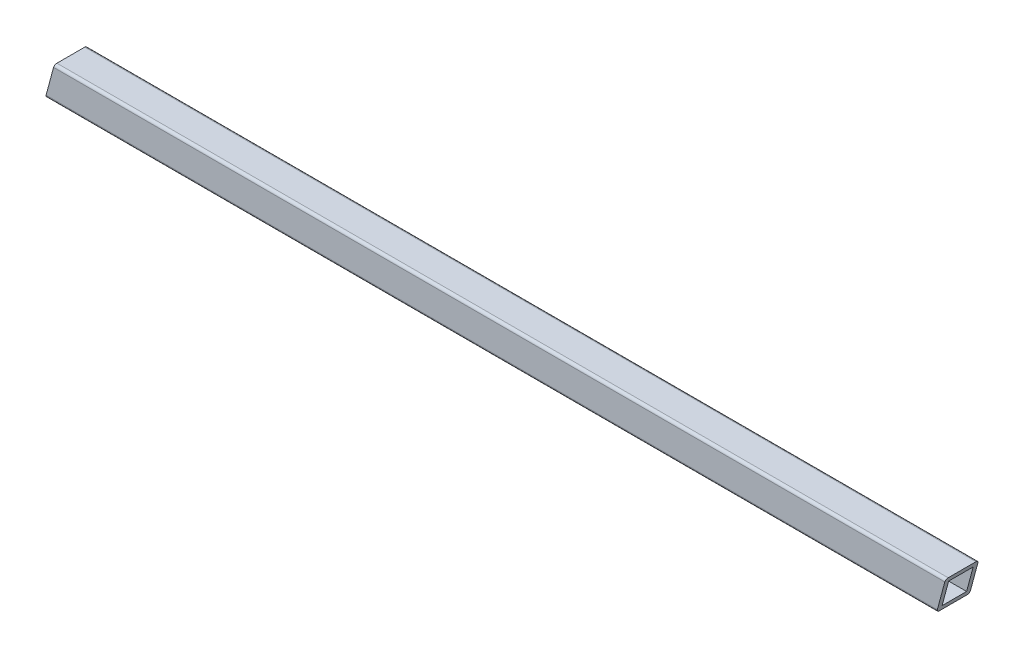
ISO-10303-21;
HEADER;
FILE_DESCRIPTION(('STEP AP214'),'2;1');
FILE_NAME('part.step','',(''),(''),'','','');
FILE_SCHEMA(('AUTOMOTIVE_DESIGN { 1 0 10303 214 1 1 1 1 }'));
ENDSEC;
DATA;
#1=APPLICATION_CONTEXT('core data for automotive mechanical design processes');
#2=APPLICATION_PROTOCOL_DEFINITION('international standard','automotive_design',2000,#1);
#3=PRODUCT_CONTEXT('',#1,'mechanical');
#4=PRODUCT('Part','Part','',(#3));
#5=PRODUCT_RELATED_PRODUCT_CATEGORY('part','',(#4));
#6=PRODUCT_DEFINITION_FORMATION('','',#4);
#7=PRODUCT_DEFINITION_CONTEXT('part definition',#1,'design');
#8=PRODUCT_DEFINITION('design','',#6,#7);
#9=PRODUCT_DEFINITION_SHAPE('','',#8);
#10=(LENGTH_UNIT() NAMED_UNIT(*) SI_UNIT(.MILLI.,.METRE.));
#11=(NAMED_UNIT(*) PLANE_ANGLE_UNIT() SI_UNIT($,.RADIAN.));
#12=(NAMED_UNIT(*) SI_UNIT($,.STERADIAN.) SOLID_ANGLE_UNIT());
#13=UNCERTAINTY_MEASURE_WITH_UNIT(LENGTH_MEASURE(1.E-05),#10,'distance_accuracy_value','');
#14=(GEOMETRIC_REPRESENTATION_CONTEXT(3) GLOBAL_UNCERTAINTY_ASSIGNED_CONTEXT((#13)) GLOBAL_UNIT_ASSIGNED_CONTEXT((#10,
#11,#12)) REPRESENTATION_CONTEXT('',''));
#15=CARTESIAN_POINT('',(0.,0.,0.));
#16=DIRECTION('',(0.,0.,1.));
#17=DIRECTION('',(1.,0.,0.));
#18=AXIS2_PLACEMENT_3D('',#15,#16,#17);
#19=CARTESIAN_POINT('',(1320.8,10.541,21.209));
#20=DIRECTION('',(-1.,0.,0.));
#21=DIRECTION('',(0.,0.,1.));
#22=AXIS2_PLACEMENT_3D('',#19,#20,#21);
#23=CYLINDRICAL_SURFACE('',#22,1.016);
#24=DIRECTION('',(-1.,0.,0.));
#25=VECTOR('',#24,1.);
#26=CARTESIAN_POINT('',(1320.8,9.525,21.209));
#27=LINE('',#26,#25);
#28=CARTESIAN_POINT('',(1215.79704525612,9.525,21.209));
#29=VERTEX_POINT('',#28);
#30=CARTESIAN_POINT('',(873.997711436341,9.525,21.209));
#31=VERTEX_POINT('',#30);
#32=EDGE_CURVE('E145',#29,#31,#27,.T.);
#33=ORIENTED_EDGE('',*,*,#32,.F.);
#34=CARTESIAN_POINT('',(1216.06928163563,10.541,21.209));
#35=DIRECTION('',(-0.965925826289069,0.258819045102517,0.));
#36=DIRECTION('',(-0.258819045102517,-0.965925826289069,0.));
#37=AXIS2_PLACEMENT_3D('',#34,#35,#36);
#38=ELLIPSE('',#37,1.05184059929664,1.016);
#39=CARTESIAN_POINT('',(1216.06928163563,10.541,22.225));
#40=VERTEX_POINT('',#39);
#41=EDGE_CURVE('E133',#29,#40,#38,.T.);
#42=ORIENTED_EDGE('',*,*,#41,.T.);
#43=DIRECTION('',(-1.,0.,0.));
#44=VECTOR('',#43,1.);
#45=CARTESIAN_POINT('',(1320.8,10.541,22.225));
#46=LINE('',#45,#44);
#47=CARTESIAN_POINT('',(874.269947815851,10.541,22.225));
#48=VERTEX_POINT('',#47);
#49=EDGE_CURVE('E143',#40,#48,#46,.T.);
#50=ORIENTED_EDGE('',*,*,#49,.T.);
#51=CARTESIAN_POINT('',(874.269947815851,10.541,21.209));
#52=DIRECTION('',(0.965925826289069,-0.258819045102516,0.));
#53=DIRECTION('',(-0.258819045102516,-0.965925826289069,0.));
#54=AXIS2_PLACEMENT_3D('',#51,#52,#53);
#55=ELLIPSE('',#54,1.05184059929664,1.016);
#56=EDGE_CURVE('E152',#48,#31,#55,.T.);
#57=ORIENTED_EDGE('',*,*,#56,.T.);
#58=EDGE_LOOP('',(#33,#42,#50,#57));
#59=FACE_BOUND('',#58,.T.);
#60=ADVANCED_FACE('F45',(#59),#23,.T.);
#61=CARTESIAN_POINT('',(1320.8,9.525,21.209));
#62=DIRECTION('',(0.,1.,0.));
#63=DIRECTION('',(0.,0.,1.));
#64=AXIS2_PLACEMENT_3D('',#61,#62,#63);
#65=PLANE('',#64);
#66=DIRECTION('',(-1.,0.,0.));
#67=VECTOR('',#66,1.);
#68=CARTESIAN_POINT('',(1320.8,9.525,10.541));
#69=LINE('',#68,#67);
#70=CARTESIAN_POINT('',(1215.79704525612,9.525,10.541));
#71=VERTEX_POINT('',#70);
#72=CARTESIAN_POINT('',(873.997711436341,9.525,10.541));
#73=VERTEX_POINT('',#72);
#74=EDGE_CURVE('E200',#71,#73,#69,.T.);
#75=ORIENTED_EDGE('',*,*,#74,.F.);
#76=DIRECTION('',(0.,0.,1.));
#77=VECTOR('',#76,1.);
#78=CARTESIAN_POINT('',(1215.79704525612,9.525,9.525));
#79=LINE('',#78,#77);
#80=EDGE_CURVE('E220',#71,#29,#79,.T.);
#81=ORIENTED_EDGE('',*,*,#80,.T.);
#82=ORIENTED_EDGE('',*,*,#32,.T.);
#83=DIRECTION('',(0.,0.,1.));
#84=VECTOR('',#83,1.);
#85=CARTESIAN_POINT('',(873.997711436341,9.525,9.525));
#86=LINE('',#85,#84);
#87=EDGE_CURVE('E53',#73,#31,#86,.T.);
#88=ORIENTED_EDGE('',*,*,#87,.F.);
#89=EDGE_LOOP('',(#75,#81,#82,#88));
#90=FACE_BOUND('',#89,.T.);
#91=ADVANCED_FACE('F219',(#90),#65,.F.);
#92=CARTESIAN_POINT('',(1320.8,10.541,10.541));
#93=DIRECTION('',(-1.,0.,0.));
#94=DIRECTION('',(0.,0.,1.));
#95=AXIS2_PLACEMENT_3D('',#92,#93,#94);
#96=CYLINDRICAL_SURFACE('',#95,1.016);
#97=DIRECTION('',(-1.,0.,0.));
#98=VECTOR('',#97,1.);
#99=CARTESIAN_POINT('',(1320.8,10.541,9.525));
#100=LINE('',#99,#98);
#101=CARTESIAN_POINT('',(1216.06928163563,10.541,9.525));
#102=VERTEX_POINT('',#101);
#103=CARTESIAN_POINT('',(874.269947815851,10.541,9.525));
#104=VERTEX_POINT('',#103);
#105=EDGE_CURVE('E198',#102,#104,#100,.T.);
#106=ORIENTED_EDGE('',*,*,#105,.F.);
#107=CARTESIAN_POINT('',(1216.06928163563,10.541,10.541));
#108=DIRECTION('',(-0.965925826289069,0.258819045102517,0.));
#109=DIRECTION('',(-0.258819045102517,-0.965925826289069,0.));
#110=AXIS2_PLACEMENT_3D('',#107,#108,#109);
#111=ELLIPSE('',#110,1.05184059929664,1.016);
#112=EDGE_CURVE('E146',#102,#71,#111,.T.);
#113=ORIENTED_EDGE('',*,*,#112,.T.);
#114=ORIENTED_EDGE('',*,*,#74,.T.);
#115=CARTESIAN_POINT('',(874.269947815851,10.541,10.541));
#116=DIRECTION('',(0.965925826289069,-0.258819045102516,0.));
#117=DIRECTION('',(-0.258819045102516,-0.965925826289069,0.));
#118=AXIS2_PLACEMENT_3D('',#115,#116,#117);
#119=ELLIPSE('',#118,1.05184059929664,1.016);
#120=EDGE_CURVE('E202',#73,#104,#119,.T.);
#121=ORIENTED_EDGE('',*,*,#120,.T.);
#122=EDGE_LOOP('',(#106,#113,#114,#121));
#123=FACE_BOUND('',#122,.T.);
#124=ADVANCED_FACE('F249',(#123),#96,.T.);
#125=CARTESIAN_POINT('',(1320.8,10.541,9.525));
#126=DIRECTION('',(0.,0.,1.));
#127=DIRECTION('',(1.,0.,0.));
#128=AXIS2_PLACEMENT_3D('',#125,#126,#127);
#129=PLANE('',#128);
#130=DIRECTION('',(-1.,0.,0.));
#131=VECTOR('',#130,1.);
#132=CARTESIAN_POINT('',(1320.8,21.209,9.525));
#133=LINE('',#132,#131);
#134=CARTESIAN_POINT('',(1218.92776362049,21.209,9.525));
#135=VERTEX_POINT('',#134);
#136=CARTESIAN_POINT('',(877.128429800706,21.209,9.525));
#137=VERTEX_POINT('',#136);
#138=EDGE_CURVE('E197',#135,#137,#133,.T.);
#139=ORIENTED_EDGE('',*,*,#138,.F.);
#140=DIRECTION('',(-0.258819045102517,-0.965925826289069,0.));
#141=VECTOR('',#140,1.);
#142=CARTESIAN_POINT('',(1219.2,22.225,9.525));
#143=LINE('',#142,#141);
#144=EDGE_CURVE('E138',#135,#102,#143,.T.);
#145=ORIENTED_EDGE('',*,*,#144,.T.);
#146=ORIENTED_EDGE('',*,*,#105,.T.);
#147=DIRECTION('',(0.258819045102516,0.965925826289069,0.));
#148=VECTOR('',#147,1.);
#149=CARTESIAN_POINT('',(877.400666180216,22.225,9.525));
#150=LINE('',#149,#148);
#151=EDGE_CURVE('E194',#104,#137,#150,.T.);
#152=ORIENTED_EDGE('',*,*,#151,.T.);
#153=EDGE_LOOP('',(#139,#145,#146,#152));
#154=FACE_BOUND('',#153,.T.);
#155=ADVANCED_FACE('F246',(#154),#129,.F.);
#156=CARTESIAN_POINT('',(1320.8,21.209,10.541));
#157=DIRECTION('',(-1.,0.,0.));
#158=DIRECTION('',(0.,0.,1.));
#159=AXIS2_PLACEMENT_3D('',#156,#157,#158);
#160=CYLINDRICAL_SURFACE('',#159,1.016);
#161=DIRECTION('',(-1.,0.,0.));
#162=VECTOR('',#161,1.);
#163=CARTESIAN_POINT('',(1320.8,22.225,10.541));
#164=LINE('',#163,#162);
#165=CARTESIAN_POINT('',(1219.2,22.225,10.541));
#166=VERTEX_POINT('',#165);
#167=CARTESIAN_POINT('',(877.400666180216,22.225,10.541));
#168=VERTEX_POINT('',#167);
#169=EDGE_CURVE('E192',#166,#168,#164,.T.);
#170=ORIENTED_EDGE('',*,*,#169,.F.);
#171=CARTESIAN_POINT('',(1218.92776362049,21.209,10.541));
#172=DIRECTION('',(-0.965925826289069,0.258819045102517,0.));
#173=DIRECTION('',(-0.258819045102517,-0.965925826289069,0.));
#174=AXIS2_PLACEMENT_3D('',#171,#172,#173);
#175=ELLIPSE('',#174,1.05184059929664,1.016);
#176=EDGE_CURVE('E234',#166,#135,#175,.T.);
#177=ORIENTED_EDGE('',*,*,#176,.T.);
#178=ORIENTED_EDGE('',*,*,#138,.T.);
#179=CARTESIAN_POINT('',(877.128429800706,21.209,10.541));
#180=DIRECTION('',(0.965925826289069,-0.258819045102516,0.));
#181=DIRECTION('',(-0.258819045102516,-0.965925826289069,0.));
#182=AXIS2_PLACEMENT_3D('',#179,#180,#181);
#183=ELLIPSE('',#182,1.05184059929664,1.016);
#184=EDGE_CURVE('E205',#137,#168,#183,.T.);
#185=ORIENTED_EDGE('',*,*,#184,.T.);
#186=EDGE_LOOP('',(#170,#177,#178,#185));
#187=FACE_BOUND('',#186,.T.);
#188=ADVANCED_FACE('F243',(#187),#160,.T.);
#189=CARTESIAN_POINT('',(1320.8,22.225,10.541));
#190=DIRECTION('',(0.,-1.,0.));
#191=DIRECTION('',(0.,0.,-1.));
#192=AXIS2_PLACEMENT_3D('',#189,#190,#191);
#193=PLANE('',#192);
#194=DIRECTION('',(-1.,0.,0.));
#195=VECTOR('',#194,1.);
#196=CARTESIAN_POINT('',(1320.8,22.225,21.209));
#197=LINE('',#196,#195);
#198=CARTESIAN_POINT('',(1219.2,22.225,21.209));
#199=VERTEX_POINT('',#198);
#200=CARTESIAN_POINT('',(877.400666180216,22.225,21.209));
#201=VERTEX_POINT('',#200);
#202=EDGE_CURVE('E191',#199,#201,#197,.T.);
#203=ORIENTED_EDGE('',*,*,#202,.F.);
#204=DIRECTION('',(0.,0.,1.));
#205=VECTOR('',#204,1.);
#206=CARTESIAN_POINT('',(1219.2,22.225,9.525));
#207=LINE('',#206,#205);
#208=EDGE_CURVE('E222',#166,#199,#207,.T.);
#209=ORIENTED_EDGE('',*,*,#208,.F.);
#210=ORIENTED_EDGE('',*,*,#169,.T.);
#211=DIRECTION('',(0.,0.,1.));
#212=VECTOR('',#211,1.);
#213=CARTESIAN_POINT('',(877.400666180216,22.225,9.525));
#214=LINE('',#213,#212);
#215=EDGE_CURVE('E188',#168,#201,#214,.T.);
#216=ORIENTED_EDGE('',*,*,#215,.T.);
#217=EDGE_LOOP('',(#203,#209,#210,#216));
#218=FACE_BOUND('',#217,.T.);
#219=ADVANCED_FACE('F252',(#218),#193,.F.);
#220=CARTESIAN_POINT('',(1320.8,21.209,21.209));
#221=DIRECTION('',(-1.,0.,0.));
#222=DIRECTION('',(0.,0.,1.));
#223=AXIS2_PLACEMENT_3D('',#220,#221,#222);
#224=CYLINDRICAL_SURFACE('',#223,1.016);
#225=DIRECTION('',(-1.,0.,0.));
#226=VECTOR('',#225,1.);
#227=CARTESIAN_POINT('',(1320.8,21.209,22.225));
#228=LINE('',#227,#226);
#229=CARTESIAN_POINT('',(1218.92776362049,21.209,22.225));
#230=VERTEX_POINT('',#229);
#231=CARTESIAN_POINT('',(877.128429800706,21.209,22.225));
#232=VERTEX_POINT('',#231);
#233=EDGE_CURVE('E157',#230,#232,#228,.T.);
#234=ORIENTED_EDGE('',*,*,#233,.F.);
#235=CARTESIAN_POINT('',(1218.92776362049,21.209,21.209));
#236=DIRECTION('',(-0.965925826289069,0.258819045102517,0.));
#237=DIRECTION('',(-0.258819045102517,-0.965925826289069,0.));
#238=AXIS2_PLACEMENT_3D('',#235,#236,#237);
#239=ELLIPSE('',#238,1.05184059929664,1.016);
#240=EDGE_CURVE('E60',#230,#199,#239,.T.);
#241=ORIENTED_EDGE('',*,*,#240,.T.);
#242=ORIENTED_EDGE('',*,*,#202,.T.);
#243=CARTESIAN_POINT('',(877.128429800706,21.209,21.209));
#244=DIRECTION('',(0.965925826289069,-0.258819045102516,0.));
#245=DIRECTION('',(-0.258819045102516,-0.965925826289069,0.));
#246=AXIS2_PLACEMENT_3D('',#243,#244,#245);
#247=ELLIPSE('',#246,1.05184059929664,1.016);
#248=EDGE_CURVE('E180',#201,#232,#247,.T.);
#249=ORIENTED_EDGE('',*,*,#248,.T.);
#250=EDGE_LOOP('',(#234,#241,#242,#249));
#251=FACE_BOUND('',#250,.T.);
#252=ADVANCED_FACE('F254',(#251),#224,.T.);
#253=CARTESIAN_POINT('',(1320.8,21.209,22.225));
#254=DIRECTION('',(0.,0.,-1.));
#255=DIRECTION('',(0.,1.,0.));
#256=AXIS2_PLACEMENT_3D('',#253,#254,#255);
#257=PLANE('',#256);
#258=ORIENTED_EDGE('',*,*,#49,.F.);
#259=DIRECTION('',(-0.258819045102517,-0.965925826289069,0.));
#260=VECTOR('',#259,1.);
#261=CARTESIAN_POINT('',(1219.2,22.225,22.225));
#262=LINE('',#261,#260);
#263=EDGE_CURVE('E130',#230,#40,#262,.T.);
#264=ORIENTED_EDGE('',*,*,#263,.F.);
#265=ORIENTED_EDGE('',*,*,#233,.T.);
#266=DIRECTION('',(0.258819045102516,0.965925826289069,0.));
#267=VECTOR('',#266,1.);
#268=CARTESIAN_POINT('',(877.400666180216,22.225,22.225));
#269=LINE('',#268,#267);
#270=EDGE_CURVE('E151',#48,#232,#269,.T.);
#271=ORIENTED_EDGE('',*,*,#270,.F.);
#272=EDGE_LOOP('',(#258,#264,#265,#271));
#273=FACE_BOUND('',#272,.T.);
#274=ADVANCED_FACE('F149',(#273),#257,.F.);
#275=CARTESIAN_POINT('',(1320.8,11.176,20.574));
#276=DIRECTION('',(0.,1.,0.));
#277=DIRECTION('',(0.,0.,1.));
#278=AXIS2_PLACEMENT_3D('',#275,#276,#277);
#279=PLANE('',#278);
#280=DIRECTION('',(0.,0.,1.));
#281=VECTOR('',#280,1.);
#282=CARTESIAN_POINT('',(1216.23942937283,11.176,20.574));
#283=LINE('',#282,#281);
#284=CARTESIAN_POINT('',(1216.23942937283,11.176,11.176));
#285=VERTEX_POINT('',#284);
#286=CARTESIAN_POINT('',(1216.23942937283,11.176,20.574));
#287=VERTEX_POINT('',#286);
#288=EDGE_CURVE('E67',#285,#287,#283,.T.);
#289=ORIENTED_EDGE('',*,*,#288,.F.);
#290=DIRECTION('',(-1.,0.,0.));
#291=VECTOR('',#290,1.);
#292=CARTESIAN_POINT('',(1320.8,11.176,11.176));
#293=LINE('',#292,#291);
#294=CARTESIAN_POINT('',(874.440095553045,11.176,11.176));
#295=VERTEX_POINT('',#294);
#296=EDGE_CURVE('E159',#285,#295,#293,.T.);
#297=ORIENTED_EDGE('',*,*,#296,.T.);
#298=DIRECTION('',(0.,0.,-1.));
#299=VECTOR('',#298,1.);
#300=CARTESIAN_POINT('',(874.440095553045,11.176,20.574));
#301=LINE('',#300,#299);
#302=CARTESIAN_POINT('',(874.440095553045,11.176,20.574));
#303=VERTEX_POINT('',#302);
#304=EDGE_CURVE('E165',#303,#295,#301,.T.);
#305=ORIENTED_EDGE('',*,*,#304,.F.);
#306=DIRECTION('',(-1.,0.,0.));
#307=VECTOR('',#306,1.);
#308=CARTESIAN_POINT('',(1320.8,11.176,20.574));
#309=LINE('',#308,#307);
#310=EDGE_CURVE('E164',#287,#303,#309,.T.);
#311=ORIENTED_EDGE('',*,*,#310,.F.);
#312=EDGE_LOOP('',(#289,#297,#305,#311));
#313=FACE_BOUND('',#312,.T.);
#314=ADVANCED_FACE('F47',(#313),#279,.T.);
#315=CARTESIAN_POINT('',(1320.8,11.176,11.176));
#316=DIRECTION('',(0.,0.,1.));
#317=DIRECTION('',(1.,0.,0.));
#318=AXIS2_PLACEMENT_3D('',#315,#316,#317);
#319=PLANE('',#318);
#320=DIRECTION('',(-0.258819045102517,-0.965925826289069,0.));
#321=VECTOR('',#320,1.);
#322=CARTESIAN_POINT('',(1223.24365948775,37.3161426567924,11.176));
#323=LINE('',#322,#321);
#324=CARTESIAN_POINT('',(1218.7576158833,20.574,11.176));
#325=VERTEX_POINT('',#324);
#326=EDGE_CURVE('E230',#325,#285,#323,.T.);
#327=ORIENTED_EDGE('',*,*,#326,.F.);
#328=DIRECTION('',(-1.,0.,0.));
#329=VECTOR('',#328,1.);
#330=CARTESIAN_POINT('',(1320.8,20.574,11.176));
#331=LINE('',#330,#329);
#332=CARTESIAN_POINT('',(876.958282063513,20.574,11.176));
#333=VERTEX_POINT('',#332);
#334=EDGE_CURVE('E161',#325,#333,#331,.T.);
#335=ORIENTED_EDGE('',*,*,#334,.T.);
#336=DIRECTION('',(0.258819045102516,0.965925826289069,0.));
#337=VECTOR('',#336,1.);
#338=CARTESIAN_POINT('',(904.340539535593,122.765976111737,11.176));
#339=LINE('',#338,#337);
#340=EDGE_CURVE('E171',#295,#333,#339,.T.);
#341=ORIENTED_EDGE('',*,*,#340,.F.);
#342=ORIENTED_EDGE('',*,*,#296,.F.);
#343=EDGE_LOOP('',(#327,#335,#341,#342));
#344=FACE_BOUND('',#343,.T.);
#345=ADVANCED_FACE('F276',(#344),#319,.T.);
#346=CARTESIAN_POINT('',(1320.8,20.574,11.176));
#347=DIRECTION('',(0.,-1.,0.));
#348=DIRECTION('',(0.,0.,-1.));
#349=AXIS2_PLACEMENT_3D('',#346,#347,#348);
#350=PLANE('',#349);
#351=DIRECTION('',(0.,0.,-1.));
#352=VECTOR('',#351,1.);
#353=CARTESIAN_POINT('',(1218.7576158833,20.574,11.176));
#354=LINE('',#353,#352);
#355=CARTESIAN_POINT('',(1218.7576158833,20.574,20.574));
#356=VERTEX_POINT('',#355);
#357=EDGE_CURVE('E224',#356,#325,#354,.T.);
#358=ORIENTED_EDGE('',*,*,#357,.F.);
#359=DIRECTION('',(-1.,0.,0.));
#360=VECTOR('',#359,1.);
#361=CARTESIAN_POINT('',(1320.8,20.574,20.574));
#362=LINE('',#361,#360);
#363=CARTESIAN_POINT('',(876.958282063513,20.574,20.574));
#364=VERTEX_POINT('',#363);
#365=EDGE_CURVE('E163',#356,#364,#362,.T.);
#366=ORIENTED_EDGE('',*,*,#365,.T.);
#367=DIRECTION('',(0.,0.,1.));
#368=VECTOR('',#367,1.);
#369=CARTESIAN_POINT('',(876.958282063513,20.574,11.176));
#370=LINE('',#369,#368);
#371=EDGE_CURVE('E177',#333,#364,#370,.T.);
#372=ORIENTED_EDGE('',*,*,#371,.F.);
#373=ORIENTED_EDGE('',*,*,#334,.F.);
#374=EDGE_LOOP('',(#358,#366,#372,#373));
#375=FACE_BOUND('',#374,.T.);
#376=ADVANCED_FACE('F274',(#375),#350,.T.);
#377=CARTESIAN_POINT('',(1320.8,20.574,20.574));
#378=DIRECTION('',(0.,0.,-1.));
#379=DIRECTION('',(0.,1.,0.));
#380=AXIS2_PLACEMENT_3D('',#377,#378,#379);
#381=PLANE('',#380);
#382=DIRECTION('',(0.258819045102517,0.965925826289069,0.));
#383=VECTOR('',#382,1.);
#384=CARTESIAN_POINT('',(1225.59315948775,46.0845960291755,20.574));
#385=LINE('',#384,#383);
#386=EDGE_CURVE('E11',#287,#356,#385,.T.);
#387=ORIENTED_EDGE('',*,*,#386,.F.);
#388=ORIENTED_EDGE('',*,*,#310,.T.);
#389=DIRECTION('',(-0.258819045102516,-0.965925826289069,0.));
#390=VECTOR('',#389,1.);
#391=CARTESIAN_POINT('',(906.690039535593,131.53442948412,20.574));
#392=LINE('',#391,#390);
#393=EDGE_CURVE('E185',#364,#303,#392,.T.);
#394=ORIENTED_EDGE('',*,*,#393,.F.);
#395=ORIENTED_EDGE('',*,*,#365,.F.);
#396=EDGE_LOOP('',(#387,#388,#394,#395));
#397=FACE_BOUND('',#396,.T.);
#398=ADVANCED_FACE('F271',(#397),#381,.T.);
#399=CARTESIAN_POINT('',(877.400666180216,22.225,9.525));
#400=DIRECTION('',(0.965925826289069,-0.258819045102516,0.));
#401=DIRECTION('',(0.258819045102516,0.965925826289069,0.));
#402=AXIS2_PLACEMENT_3D('',#399,#400,#401);
#403=PLANE('',#402);
#404=ORIENTED_EDGE('',*,*,#304,.T.);
#405=ORIENTED_EDGE('',*,*,#340,.T.);
#406=ORIENTED_EDGE('',*,*,#371,.T.);
#407=ORIENTED_EDGE('',*,*,#393,.T.);
#408=EDGE_LOOP('',(#404,#405,#406,#407));
#409=FACE_BOUND('',#408,.T.);
#410=ORIENTED_EDGE('',*,*,#270,.T.);
#411=ORIENTED_EDGE('',*,*,#248,.F.);
#412=ORIENTED_EDGE('',*,*,#215,.F.);
#413=ORIENTED_EDGE('',*,*,#184,.F.);
#414=ORIENTED_EDGE('',*,*,#151,.F.);
#415=ORIENTED_EDGE('',*,*,#120,.F.);
#416=ORIENTED_EDGE('',*,*,#87,.T.);
#417=ORIENTED_EDGE('',*,*,#56,.F.);
#418=EDGE_LOOP('',(#410,#411,#412,#413,#414,#415,#416,#417));
#419=FACE_BOUND('',#418,.T.);
#420=ADVANCED_FACE('F211',(#409,#419),#403,.F.);
#421=CARTESIAN_POINT('',(1219.2,22.225,9.525));
#422=DIRECTION('',(-0.965925826289069,0.258819045102517,0.));
#423=DIRECTION('',(-0.258819045102517,-0.965925826289069,0.));
#424=AXIS2_PLACEMENT_3D('',#421,#422,#423);
#425=PLANE('',#424);
#426=ORIENTED_EDGE('',*,*,#288,.T.);
#427=ORIENTED_EDGE('',*,*,#386,.T.);
#428=ORIENTED_EDGE('',*,*,#357,.T.);
#429=ORIENTED_EDGE('',*,*,#326,.T.);
#430=EDGE_LOOP('',(#426,#427,#428,#429));
#431=FACE_BOUND('',#430,.T.);
#432=ORIENTED_EDGE('',*,*,#80,.F.);
#433=ORIENTED_EDGE('',*,*,#112,.F.);
#434=ORIENTED_EDGE('',*,*,#144,.F.);
#435=ORIENTED_EDGE('',*,*,#176,.F.);
#436=ORIENTED_EDGE('',*,*,#208,.T.);
#437=ORIENTED_EDGE('',*,*,#240,.F.);
#438=ORIENTED_EDGE('',*,*,#263,.T.);
#439=ORIENTED_EDGE('',*,*,#41,.F.);
#440=EDGE_LOOP('',(#432,#433,#434,#435,#436,#437,#438,#439));
#441=FACE_BOUND('',#440,.T.);
#442=ADVANCED_FACE('F132',(#431,#441),#425,.F.);
#443=CLOSED_SHELL('',(#60,#91,#124,#155,#188,#219,#252,#274,#314,#345,#376,#398,#420,#442));
#444=MANIFOLD_SOLID_BREP('B2',#443);
#445=ADVANCED_BREP_SHAPE_REPRESENTATION('',(#18,#444),#14);
#446=SHAPE_DEFINITION_REPRESENTATION(#9,#445);
ENDSEC;
END-ISO-10303-21;
